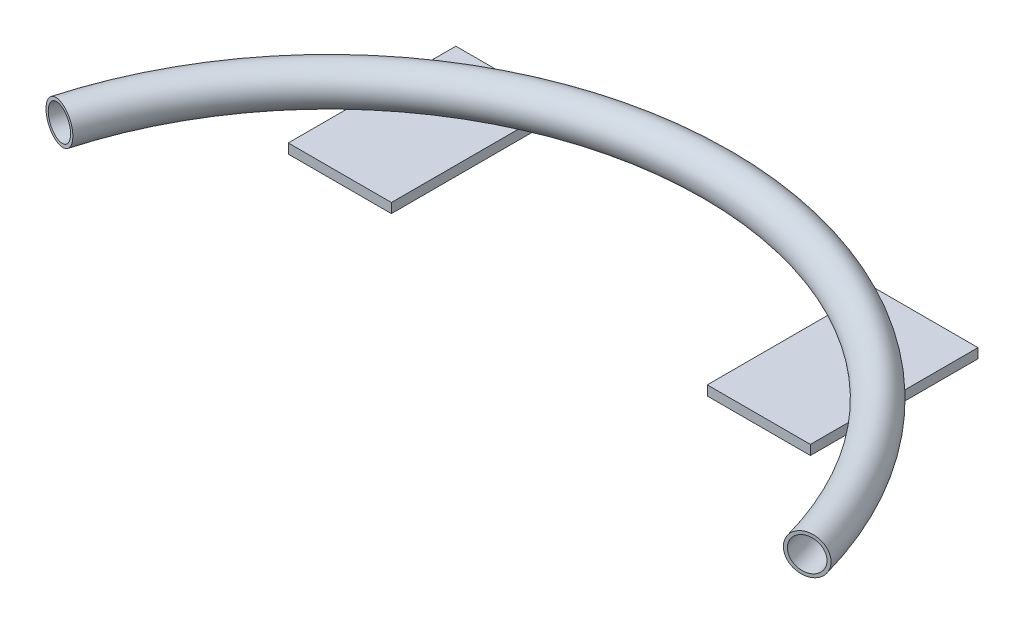
ISO-10303-21;
HEADER;
FILE_DESCRIPTION(('STEP AP214'),'2;1');
FILE_NAME('part.step','',(''),(''),'','','');
FILE_SCHEMA(('AUTOMOTIVE_DESIGN { 1 0 10303 214 1 1 1 1 }'));
ENDSEC;
DATA;
#1=APPLICATION_CONTEXT('core data for automotive mechanical design processes');
#2=APPLICATION_PROTOCOL_DEFINITION('international standard','automotive_design',2000,#1);
#3=PRODUCT_CONTEXT('',#1,'mechanical');
#4=PRODUCT('Part','Part','',(#3));
#5=PRODUCT_RELATED_PRODUCT_CATEGORY('part','',(#4));
#6=PRODUCT_DEFINITION_FORMATION('','',#4);
#7=PRODUCT_DEFINITION_CONTEXT('part definition',#1,'design');
#8=PRODUCT_DEFINITION('design','',#6,#7);
#9=PRODUCT_DEFINITION_SHAPE('','',#8);
#10=(LENGTH_UNIT() NAMED_UNIT(*) SI_UNIT(.MILLI.,.METRE.));
#11=(NAMED_UNIT(*) PLANE_ANGLE_UNIT() SI_UNIT($,.RADIAN.));
#12=(NAMED_UNIT(*) SI_UNIT($,.STERADIAN.) SOLID_ANGLE_UNIT());
#13=UNCERTAINTY_MEASURE_WITH_UNIT(LENGTH_MEASURE(1.E-05),#10,'distance_accuracy_value','');
#14=(GEOMETRIC_REPRESENTATION_CONTEXT(3) GLOBAL_UNCERTAINTY_ASSIGNED_CONTEXT((#13)) GLOBAL_UNIT_ASSIGNED_CONTEXT((#10,
#11,#12)) REPRESENTATION_CONTEXT('',''));
#15=CARTESIAN_POINT('',(0.,0.,0.));
#16=DIRECTION('',(0.,0.,1.));
#17=DIRECTION('',(1.,0.,0.));
#18=AXIS2_PLACEMENT_3D('',#15,#16,#17);
#19=CARTESIAN_POINT('',(-155.575,-28.575,-114.3));
#20=DIRECTION('',(1.,0.,0.));
#21=DIRECTION('',(0.,0.,-1.));
#22=AXIS2_PLACEMENT_3D('',#19,#20,#21);
#23=PLANE('',#22);
#24=DIRECTION('',(0.,0.,-1.));
#25=VECTOR('',#24,1.);
#26=CARTESIAN_POINT('',(-155.575,-19.05,-114.3));
#27=LINE('',#26,#25);
#28=CARTESIAN_POINT('',(-155.575,-19.05,-114.3));
#29=VERTEX_POINT('',#28);
#30=CARTESIAN_POINT('',(-155.575,-19.05,-279.4));
#31=VERTEX_POINT('',#30);
#32=EDGE_CURVE('E77',#29,#31,#27,.T.);
#33=ORIENTED_EDGE('',*,*,#32,.F.);
#34=DIRECTION('',(0.,1.,0.));
#35=VECTOR('',#34,1.);
#36=CARTESIAN_POINT('',(-155.575,-28.575,-114.3));
#37=LINE('',#36,#35);
#38=CARTESIAN_POINT('',(-155.575,-28.575,-114.3));
#39=VERTEX_POINT('',#38);
#40=EDGE_CURVE('E12',#39,#29,#37,.T.);
#41=ORIENTED_EDGE('',*,*,#40,.F.);
#42=DIRECTION('',(0.,0.,-1.));
#43=VECTOR('',#42,1.);
#44=CARTESIAN_POINT('',(-155.575,-28.575,-114.3));
#45=LINE('',#44,#43);
#46=CARTESIAN_POINT('',(-155.575,-28.575,-279.4));
#47=VERTEX_POINT('',#46);
#48=EDGE_CURVE('E79',#39,#47,#45,.T.);
#49=ORIENTED_EDGE('',*,*,#48,.T.);
#50=DIRECTION('',(0.,1.,0.));
#51=VECTOR('',#50,1.);
#52=CARTESIAN_POINT('',(-155.575,-28.575,-279.4));
#53=LINE('',#52,#51);
#54=EDGE_CURVE('E40',#47,#31,#53,.T.);
#55=ORIENTED_EDGE('',*,*,#54,.T.);
#56=EDGE_LOOP('',(#33,#41,#49,#55));
#57=FACE_BOUND('',#56,.T.);
#58=ADVANCED_FACE('F37',(#57),#23,.T.);
#59=CARTESIAN_POINT('',(-155.575,-28.575,-114.3));
#60=DIRECTION('',(0.,0.,1.));
#61=DIRECTION('',(1.,0.,0.));
#62=AXIS2_PLACEMENT_3D('',#59,#60,#61);
#63=PLANE('',#62);
#64=DIRECTION('',(1.,0.,0.));
#65=VECTOR('',#64,1.);
#66=CARTESIAN_POINT('',(-155.575,-19.05,-114.3));
#67=LINE('',#66,#65);
#68=CARTESIAN_POINT('',(-257.175,-19.05,-114.3));
#69=VERTEX_POINT('',#68);
#70=EDGE_CURVE('E94',#69,#29,#67,.T.);
#71=ORIENTED_EDGE('',*,*,#70,.F.);
#72=DIRECTION('',(0.,1.,0.));
#73=VECTOR('',#72,1.);
#74=CARTESIAN_POINT('',(-257.175,-28.575,-114.3));
#75=LINE('',#74,#73);
#76=CARTESIAN_POINT('',(-257.175,-28.575,-114.3));
#77=VERTEX_POINT('',#76);
#78=EDGE_CURVE('E45',#77,#69,#75,.T.);
#79=ORIENTED_EDGE('',*,*,#78,.F.);
#80=DIRECTION('',(1.,0.,0.));
#81=VECTOR('',#80,1.);
#82=CARTESIAN_POINT('',(-155.575,-28.575,-114.3));
#83=LINE('',#82,#81);
#84=EDGE_CURVE('E84',#77,#39,#83,.T.);
#85=ORIENTED_EDGE('',*,*,#84,.T.);
#86=ORIENTED_EDGE('',*,*,#40,.T.);
#87=EDGE_LOOP('',(#71,#79,#85,#86));
#88=FACE_BOUND('',#87,.T.);
#89=ADVANCED_FACE('F109',(#88),#63,.T.);
#90=CARTESIAN_POINT('',(-257.175,-28.575,-114.3));
#91=DIRECTION('',(-1.,0.,0.));
#92=DIRECTION('',(0.,0.,1.));
#93=AXIS2_PLACEMENT_3D('',#90,#91,#92);
#94=PLANE('',#93);
#95=DIRECTION('',(0.,0.,1.));
#96=VECTOR('',#95,1.);
#97=CARTESIAN_POINT('',(-257.175,-19.05,-114.3));
#98=LINE('',#97,#96);
#99=CARTESIAN_POINT('',(-257.175,-19.05,-279.4));
#100=VERTEX_POINT('',#99);
#101=EDGE_CURVE('E91',#100,#69,#98,.T.);
#102=ORIENTED_EDGE('',*,*,#101,.F.);
#103=DIRECTION('',(0.,1.,0.));
#104=VECTOR('',#103,1.);
#105=CARTESIAN_POINT('',(-257.175,-28.575,-279.4));
#106=LINE('',#105,#104);
#107=CARTESIAN_POINT('',(-257.175,-28.575,-279.4));
#108=VERTEX_POINT('',#107);
#109=EDGE_CURVE('E83',#108,#100,#106,.T.);
#110=ORIENTED_EDGE('',*,*,#109,.F.);
#111=DIRECTION('',(0.,0.,1.));
#112=VECTOR('',#111,1.);
#113=CARTESIAN_POINT('',(-257.175,-28.575,-114.3));
#114=LINE('',#113,#112);
#115=EDGE_CURVE('E102',#108,#77,#114,.T.);
#116=ORIENTED_EDGE('',*,*,#115,.T.);
#117=ORIENTED_EDGE('',*,*,#78,.T.);
#118=EDGE_LOOP('',(#102,#110,#116,#117));
#119=FACE_BOUND('',#118,.T.);
#120=ADVANCED_FACE('F106',(#119),#94,.T.);
#121=CARTESIAN_POINT('',(-155.575,-28.575,-279.4));
#122=DIRECTION('',(0.,0.,-1.));
#123=DIRECTION('',(-1.,0.,0.));
#124=AXIS2_PLACEMENT_3D('',#121,#122,#123);
#125=PLANE('',#124);
#126=DIRECTION('',(-1.,0.,0.));
#127=VECTOR('',#126,1.);
#128=CARTESIAN_POINT('',(-155.575,-19.05,-279.4));
#129=LINE('',#128,#127);
#130=EDGE_CURVE('E86',#31,#100,#129,.T.);
#131=ORIENTED_EDGE('',*,*,#130,.F.);
#132=ORIENTED_EDGE('',*,*,#54,.F.);
#133=DIRECTION('',(-1.,0.,0.));
#134=VECTOR('',#133,1.);
#135=CARTESIAN_POINT('',(-155.575,-28.575,-279.4));
#136=LINE('',#135,#134);
#137=EDGE_CURVE('E100',#47,#108,#136,.T.);
#138=ORIENTED_EDGE('',*,*,#137,.T.);
#139=ORIENTED_EDGE('',*,*,#109,.T.);
#140=EDGE_LOOP('',(#131,#132,#138,#139));
#141=FACE_BOUND('',#140,.T.);
#142=ADVANCED_FACE('F87',(#141),#125,.T.);
#143=CARTESIAN_POINT('',(-155.575,-28.575,-279.4));
#144=DIRECTION('',(0.,1.,0.));
#145=DIRECTION('',(0.,0.,1.));
#146=AXIS2_PLACEMENT_3D('',#143,#144,#145);
#147=PLANE('',#146);
#148=ORIENTED_EDGE('',*,*,#48,.F.);
#149=ORIENTED_EDGE('',*,*,#84,.F.);
#150=ORIENTED_EDGE('',*,*,#115,.F.);
#151=ORIENTED_EDGE('',*,*,#137,.F.);
#152=EDGE_LOOP('',(#148,#149,#150,#151));
#153=FACE_BOUND('',#152,.T.);
#154=ADVANCED_FACE('F111',(#153),#147,.F.);
#155=CARTESIAN_POINT('',(-155.575,-19.05,-279.4));
#156=DIRECTION('',(0.,1.,0.));
#157=DIRECTION('',(0.,0.,1.));
#158=AXIS2_PLACEMENT_3D('',#155,#156,#157);
#159=PLANE('',#158);
#160=ORIENTED_EDGE('',*,*,#32,.T.);
#161=ORIENTED_EDGE('',*,*,#130,.T.);
#162=ORIENTED_EDGE('',*,*,#101,.T.);
#163=ORIENTED_EDGE('',*,*,#70,.T.);
#164=EDGE_LOOP('',(#160,#161,#162,#163));
#165=FACE_BOUND('',#164,.T.);
#166=ADVANCED_FACE('F93',(#165),#159,.T.);
#167=CLOSED_SHELL('',(#58,#89,#120,#142,#154,#166));
#168=MANIFOLD_SOLID_BREP('B2',#167);
#169=CARTESIAN_POINT('',(257.175,-28.575,-114.3));
#170=DIRECTION('',(1.,0.,0.));
#171=DIRECTION('',(0.,0.,-1.));
#172=AXIS2_PLACEMENT_3D('',#169,#170,#171);
#173=PLANE('',#172);
#174=DIRECTION('',(0.,0.,-1.));
#175=VECTOR('',#174,1.);
#176=CARTESIAN_POINT('',(257.175,-19.05,-114.3));
#177=LINE('',#176,#175);
#178=CARTESIAN_POINT('',(257.175,-19.05,-114.3));
#179=VERTEX_POINT('',#178);
#180=CARTESIAN_POINT('',(257.175,-19.05,-279.4));
#181=VERTEX_POINT('',#180);
#182=EDGE_CURVE('E195',#179,#181,#177,.T.);
#183=ORIENTED_EDGE('',*,*,#182,.F.);
#184=DIRECTION('',(0.,1.,0.));
#185=VECTOR('',#184,1.);
#186=CARTESIAN_POINT('',(257.175,-28.575,-114.3));
#187=LINE('',#186,#185);
#188=CARTESIAN_POINT('',(257.175,-28.575,-114.3));
#189=VERTEX_POINT('',#188);
#190=EDGE_CURVE('E35',#189,#179,#187,.T.);
#191=ORIENTED_EDGE('',*,*,#190,.F.);
#192=DIRECTION('',(0.,0.,-1.));
#193=VECTOR('',#192,1.);
#194=CARTESIAN_POINT('',(257.175,-28.575,-114.3));
#195=LINE('',#194,#193);
#196=CARTESIAN_POINT('',(257.175,-28.575,-279.4));
#197=VERTEX_POINT('',#196);
#198=EDGE_CURVE('E197',#189,#197,#195,.T.);
#199=ORIENTED_EDGE('',*,*,#198,.T.);
#200=DIRECTION('',(0.,1.,0.));
#201=VECTOR('',#200,1.);
#202=CARTESIAN_POINT('',(257.175,-28.575,-279.4));
#203=LINE('',#202,#201);
#204=EDGE_CURVE('E158',#197,#181,#203,.T.);
#205=ORIENTED_EDGE('',*,*,#204,.T.);
#206=EDGE_LOOP('',(#183,#191,#199,#205));
#207=FACE_BOUND('',#206,.T.);
#208=ADVANCED_FACE('F155',(#207),#173,.T.);
#209=CARTESIAN_POINT('',(257.175,-28.575,-114.3));
#210=DIRECTION('',(0.,0.,1.));
#211=DIRECTION('',(1.,0.,0.));
#212=AXIS2_PLACEMENT_3D('',#209,#210,#211);
#213=PLANE('',#212);
#214=DIRECTION('',(1.,0.,0.));
#215=VECTOR('',#214,1.);
#216=CARTESIAN_POINT('',(257.175,-19.05,-114.3));
#217=LINE('',#216,#215);
#218=CARTESIAN_POINT('',(155.575,-19.05,-114.3));
#219=VERTEX_POINT('',#218);
#220=EDGE_CURVE('E212',#219,#179,#217,.T.);
#221=ORIENTED_EDGE('',*,*,#220,.F.);
#222=DIRECTION('',(0.,1.,0.));
#223=VECTOR('',#222,1.);
#224=CARTESIAN_POINT('',(155.575,-28.575,-114.3));
#225=LINE('',#224,#223);
#226=CARTESIAN_POINT('',(155.575,-28.575,-114.3));
#227=VERTEX_POINT('',#226);
#228=EDGE_CURVE('E163',#227,#219,#225,.T.);
#229=ORIENTED_EDGE('',*,*,#228,.F.);
#230=DIRECTION('',(1.,0.,0.));
#231=VECTOR('',#230,1.);
#232=CARTESIAN_POINT('',(257.175,-28.575,-114.3));
#233=LINE('',#232,#231);
#234=EDGE_CURVE('E202',#227,#189,#233,.T.);
#235=ORIENTED_EDGE('',*,*,#234,.T.);
#236=ORIENTED_EDGE('',*,*,#190,.T.);
#237=EDGE_LOOP('',(#221,#229,#235,#236));
#238=FACE_BOUND('',#237,.T.);
#239=ADVANCED_FACE('F227',(#238),#213,.T.);
#240=CARTESIAN_POINT('',(155.575,-28.575,-114.3));
#241=DIRECTION('',(-1.,0.,0.));
#242=DIRECTION('',(0.,0.,1.));
#243=AXIS2_PLACEMENT_3D('',#240,#241,#242);
#244=PLANE('',#243);
#245=DIRECTION('',(0.,0.,1.));
#246=VECTOR('',#245,1.);
#247=CARTESIAN_POINT('',(155.575,-19.05,-114.3));
#248=LINE('',#247,#246);
#249=CARTESIAN_POINT('',(155.575,-19.05,-279.4));
#250=VERTEX_POINT('',#249);
#251=EDGE_CURVE('E209',#250,#219,#248,.T.);
#252=ORIENTED_EDGE('',*,*,#251,.F.);
#253=DIRECTION('',(0.,1.,0.));
#254=VECTOR('',#253,1.);
#255=CARTESIAN_POINT('',(155.575,-28.575,-279.4));
#256=LINE('',#255,#254);
#257=CARTESIAN_POINT('',(155.575,-28.575,-279.4));
#258=VERTEX_POINT('',#257);
#259=EDGE_CURVE('E201',#258,#250,#256,.T.);
#260=ORIENTED_EDGE('',*,*,#259,.F.);
#261=DIRECTION('',(0.,0.,1.));
#262=VECTOR('',#261,1.);
#263=CARTESIAN_POINT('',(155.575,-28.575,-114.3));
#264=LINE('',#263,#262);
#265=EDGE_CURVE('E220',#258,#227,#264,.T.);
#266=ORIENTED_EDGE('',*,*,#265,.T.);
#267=ORIENTED_EDGE('',*,*,#228,.T.);
#268=EDGE_LOOP('',(#252,#260,#266,#267));
#269=FACE_BOUND('',#268,.T.);
#270=ADVANCED_FACE('F224',(#269),#244,.T.);
#271=CARTESIAN_POINT('',(257.175,-28.575,-279.4));
#272=DIRECTION('',(0.,0.,-1.));
#273=DIRECTION('',(-1.,0.,0.));
#274=AXIS2_PLACEMENT_3D('',#271,#272,#273);
#275=PLANE('',#274);
#276=DIRECTION('',(-1.,0.,0.));
#277=VECTOR('',#276,1.);
#278=CARTESIAN_POINT('',(257.175,-19.05,-279.4));
#279=LINE('',#278,#277);
#280=EDGE_CURVE('E204',#181,#250,#279,.T.);
#281=ORIENTED_EDGE('',*,*,#280,.F.);
#282=ORIENTED_EDGE('',*,*,#204,.F.);
#283=DIRECTION('',(-1.,0.,0.));
#284=VECTOR('',#283,1.);
#285=CARTESIAN_POINT('',(257.175,-28.575,-279.4));
#286=LINE('',#285,#284);
#287=EDGE_CURVE('E218',#197,#258,#286,.T.);
#288=ORIENTED_EDGE('',*,*,#287,.T.);
#289=ORIENTED_EDGE('',*,*,#259,.T.);
#290=EDGE_LOOP('',(#281,#282,#288,#289));
#291=FACE_BOUND('',#290,.T.);
#292=ADVANCED_FACE('F205',(#291),#275,.T.);
#293=CARTESIAN_POINT('',(257.175,-28.575,-279.4));
#294=DIRECTION('',(0.,1.,0.));
#295=DIRECTION('',(0.,0.,1.));
#296=AXIS2_PLACEMENT_3D('',#293,#294,#295);
#297=PLANE('',#296);
#298=ORIENTED_EDGE('',*,*,#198,.F.);
#299=ORIENTED_EDGE('',*,*,#234,.F.);
#300=ORIENTED_EDGE('',*,*,#265,.F.);
#301=ORIENTED_EDGE('',*,*,#287,.F.);
#302=EDGE_LOOP('',(#298,#299,#300,#301));
#303=FACE_BOUND('',#302,.T.);
#304=ADVANCED_FACE('F229',(#303),#297,.F.);
#305=CARTESIAN_POINT('',(257.175,-19.05,-279.4));
#306=DIRECTION('',(0.,1.,0.));
#307=DIRECTION('',(0.,0.,1.));
#308=AXIS2_PLACEMENT_3D('',#305,#306,#307);
#309=PLANE('',#308);
#310=ORIENTED_EDGE('',*,*,#182,.T.);
#311=ORIENTED_EDGE('',*,*,#280,.T.);
#312=ORIENTED_EDGE('',*,*,#251,.T.);
#313=ORIENTED_EDGE('',*,*,#220,.T.);
#314=EDGE_LOOP('',(#310,#311,#312,#313));
#315=FACE_BOUND('',#314,.T.);
#316=ADVANCED_FACE('F211',(#315),#309,.T.);
#317=CLOSED_SHELL('',(#208,#239,#270,#292,#304,#316));
#318=MANIFOLD_SOLID_BREP('B6',#317);
#319=CARTESIAN_POINT('',(0.,0.,103.043181818182));
#320=DIRECTION('',(0.,-1.,0.));
#321=DIRECTION('',(0.,0.,-1.));
#322=AXIS2_PLACEMENT_3D('',#319,#320,#321);
#323=TOROIDAL_SURFACE('',#322,382.443181818182,15.875);
#324=CARTESIAN_POINT('',(-368.3,0.,2.4980018054066E-13));
#325=DIRECTION('',(0.269433962264151,0.,-0.963018867924528));
#326=DIRECTION('',(-0.963018867924528,0.,-0.269433962264151));
#327=AXIS2_PLACEMENT_3D('',#324,#325,#326);
#328=CIRCLE('',#327,15.875);
#329=CARTESIAN_POINT('',(-383.587924528302,0.,-4.27726415094315));
#330=VERTEX_POINT('',#329);
#331=EDGE_CURVE('E273',#330,#330,#328,.T.);
#332=CARTESIAN_POINT('',(368.3,0.,0.));
#333=DIRECTION('',(0.269433962264151,0.,0.963018867924528));
#334=DIRECTION('',(0.963018867924528,0.,-0.269433962264151));
#335=AXIS2_PLACEMENT_3D('',#332,#333,#334);
#336=CIRCLE('',#335,15.875);
#337=CARTESIAN_POINT('',(383.587924528302,0.,-4.27726415094337));
#338=VERTEX_POINT('',#337);
#339=EDGE_CURVE('E281',#338,#338,#336,.T.);
#340=CARTESIAN_POINT('',(0.,0.,103.043181818182));
#341=DIRECTION('',(0.,-1.,0.));
#342=DIRECTION('',(0.,0.,-1.));
#343=AXIS2_PLACEMENT_3D('',#340,#341,#342);
#344=CIRCLE('',#343,398.318181818182);
#345=EDGE_CURVE('',#330,#338,#344,.T.);
#346=ORIENTED_EDGE('',*,*,#331,.F.);
#347=ORIENTED_EDGE('',*,*,#339,.T.);
#348=ORIENTED_EDGE('',*,*,#345,.T.);
#349=ORIENTED_EDGE('',*,*,#345,.F.);
#350=EDGE_LOOP('',(#346,#348,#347,#349));
#351=FACE_BOUND('',#350,.T.);
#352=ADVANCED_FACE('F266',(#351),#323,.F.);
#353=CARTESIAN_POINT('',(0.,0.,103.043181818182));
#354=DIRECTION('',(0.,-1.,0.));
#355=DIRECTION('',(0.,0.,-1.));
#356=AXIS2_PLACEMENT_3D('',#353,#354,#355);
#357=TOROIDAL_SURFACE('',#356,382.443181818182,19.05);
#358=CARTESIAN_POINT('',(-368.3,0.,2.4980018054066E-13));
#359=DIRECTION('',(0.269433962264151,0.,-0.963018867924528));
#360=DIRECTION('',(-0.963018867924528,0.,-0.269433962264151));
#361=AXIS2_PLACEMENT_3D('',#358,#359,#360);
#362=CIRCLE('',#361,19.05);
#363=CARTESIAN_POINT('',(-386.645509433962,0.,-5.13271698113184));
#364=VERTEX_POINT('',#363);
#365=EDGE_CURVE('E154',#364,#364,#362,.T.);
#366=CARTESIAN_POINT('',(368.3,0.,0.));
#367=DIRECTION('',(0.269433962264151,0.,0.963018867924528));
#368=DIRECTION('',(0.963018867924528,0.,-0.269433962264151));
#369=AXIS2_PLACEMENT_3D('',#366,#367,#368);
#370=CIRCLE('',#369,19.05);
#371=CARTESIAN_POINT('',(386.645509433962,0.,-5.13271698113206));
#372=VERTEX_POINT('',#371);
#373=EDGE_CURVE('E277',#372,#372,#370,.T.);
#374=CARTESIAN_POINT('',(0.,0.,103.043181818182));
#375=DIRECTION('',(0.,-1.,0.));
#376=DIRECTION('',(0.,0.,-1.));
#377=AXIS2_PLACEMENT_3D('',#374,#375,#376);
#378=CIRCLE('',#377,401.493181818182);
#379=EDGE_CURVE('',#364,#372,#378,.T.);
#380=ORIENTED_EDGE('',*,*,#365,.T.);
#381=ORIENTED_EDGE('',*,*,#373,.F.);
#382=ORIENTED_EDGE('',*,*,#379,.T.);
#383=ORIENTED_EDGE('',*,*,#379,.F.);
#384=EDGE_LOOP('',(#380,#382,#381,#383));
#385=FACE_BOUND('',#384,.T.);
#386=ADVANCED_FACE('F268',(#385),#357,.T.);
#387=CARTESIAN_POINT('',(-368.3,0.,2.4980018054066E-13));
#388=DIRECTION('',(0.269433962264151,0.,-0.963018867924528));
#389=DIRECTION('',(-0.963018867924528,0.,-0.269433962264151));
#390=AXIS2_PLACEMENT_3D('',#387,#388,#389);
#391=PLANE('',#390);
#392=ORIENTED_EDGE('',*,*,#331,.T.);
#393=EDGE_LOOP('',(#392));
#394=FACE_BOUND('',#393,.T.);
#395=ORIENTED_EDGE('',*,*,#365,.F.);
#396=EDGE_LOOP('',(#395));
#397=FACE_BOUND('',#396,.T.);
#398=ADVANCED_FACE('F291',(#394,#397),#391,.F.);
#399=CARTESIAN_POINT('',(368.3,0.,0.));
#400=DIRECTION('',(0.269433962264151,0.,0.963018867924528));
#401=DIRECTION('',(0.963018867924528,0.,-0.269433962264151));
#402=AXIS2_PLACEMENT_3D('',#399,#400,#401);
#403=PLANE('',#402);
#404=ORIENTED_EDGE('',*,*,#339,.F.);
#405=EDGE_LOOP('',(#404));
#406=FACE_BOUND('',#405,.T.);
#407=ORIENTED_EDGE('',*,*,#373,.T.);
#408=EDGE_LOOP('',(#407));
#409=FACE_BOUND('',#408,.T.);
#410=ADVANCED_FACE('F288',(#406,#409),#403,.T.);
#411=CLOSED_SHELL('',(#352,#386,#398,#410));
#412=MANIFOLD_SOLID_BREP('B29',#411);
#413=ADVANCED_BREP_SHAPE_REPRESENTATION('',(#18,#168,#318,#412),#14);
#414=SHAPE_DEFINITION_REPRESENTATION(#9,#413);
ENDSEC;
END-ISO-10303-21;
